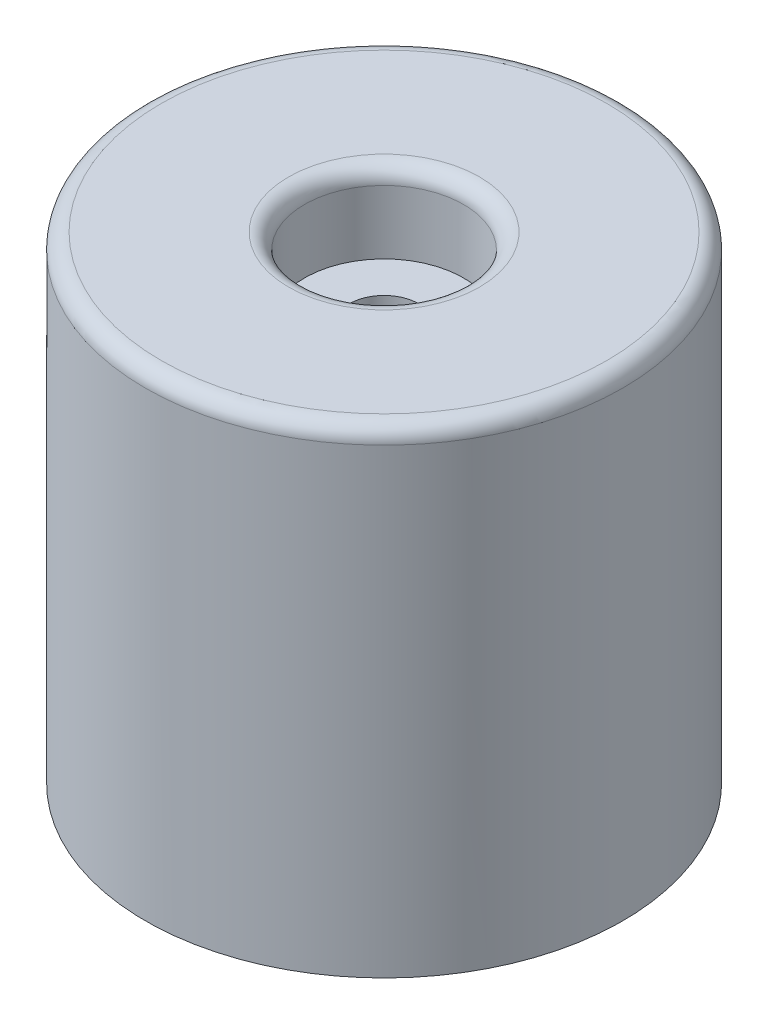
ISO-10303-21;
HEADER;
FILE_DESCRIPTION(('STEP AP214'),'2;1');
FILE_NAME('part.step','',(''),(''),'','','');
FILE_SCHEMA(('AUTOMOTIVE_DESIGN { 1 0 10303 214 1 1 1 1 }'));
ENDSEC;
DATA;
#1=APPLICATION_CONTEXT('core data for automotive mechanical design processes');
#2=APPLICATION_PROTOCOL_DEFINITION('international standard','automotive_design',2000,#1);
#3=PRODUCT_CONTEXT('',#1,'mechanical');
#4=PRODUCT('Part','Part','',(#3));
#5=PRODUCT_RELATED_PRODUCT_CATEGORY('part','',(#4));
#6=PRODUCT_DEFINITION_FORMATION('','',#4);
#7=PRODUCT_DEFINITION_CONTEXT('part definition',#1,'design');
#8=PRODUCT_DEFINITION('design','',#6,#7);
#9=PRODUCT_DEFINITION_SHAPE('','',#8);
#10=(LENGTH_UNIT() NAMED_UNIT(*) SI_UNIT(.MILLI.,.METRE.));
#11=(NAMED_UNIT(*) PLANE_ANGLE_UNIT() SI_UNIT($,.RADIAN.));
#12=(NAMED_UNIT(*) SI_UNIT($,.STERADIAN.) SOLID_ANGLE_UNIT());
#13=UNCERTAINTY_MEASURE_WITH_UNIT(LENGTH_MEASURE(1.E-05),#10,'distance_accuracy_value','');
#14=(GEOMETRIC_REPRESENTATION_CONTEXT(3) GLOBAL_UNCERTAINTY_ASSIGNED_CONTEXT((#13)) GLOBAL_UNIT_ASSIGNED_CONTEXT((#10,
#11,#12)) REPRESENTATION_CONTEXT('',''));
#15=CARTESIAN_POINT('',(0.,0.,0.));
#16=DIRECTION('',(0.,0.,1.));
#17=DIRECTION('',(1.,0.,0.));
#18=AXIS2_PLACEMENT_3D('',#15,#16,#17);
#19=CARTESIAN_POINT('',(0.,38.1,0.));
#20=DIRECTION('',(0.,-1.,0.));
#21=DIRECTION('',(0.,0.,-1.));
#22=AXIS2_PLACEMENT_3D('',#19,#20,#21);
#23=CYLINDRICAL_SURFACE('',#22,19.05);
#24=CARTESIAN_POINT('',(0.,36.83,0.));
#25=DIRECTION('',(0.,1.,0.));
#26=DIRECTION('',(0.,0.,1.));
#27=AXIS2_PLACEMENT_3D('',#24,#25,#26);
#28=CIRCLE('',#27,19.05);
#29=CARTESIAN_POINT('',(0.,36.83,-19.05));
#30=VERTEX_POINT('',#29);
#31=EDGE_CURVE('E10',#30,#30,#28,.F.);
#32=CARTESIAN_POINT('',(0.,0.,0.));
#33=DIRECTION('',(0.,1.,0.));
#34=DIRECTION('',(0.,0.,1.));
#35=AXIS2_PLACEMENT_3D('',#32,#33,#34);
#36=CIRCLE('',#35,19.05);
#37=CARTESIAN_POINT('',(0.,0.,-19.05));
#38=VERTEX_POINT('',#37);
#39=EDGE_CURVE('E52',#38,#38,#36,.T.);
#40=CARTESIAN_POINT('',(0.,36.83,-19.05));
#41=CARTESIAN_POINT('',(0.,36.4463541666667,-19.05));
#42=CARTESIAN_POINT('',(0.,36.0627083333333,-19.05));
#43=CARTESIAN_POINT('',(0.,35.2954166666667,-19.05));
#44=CARTESIAN_POINT('',(0.,34.9117708333333,-19.05));
#45=CARTESIAN_POINT('',(0.,34.1444791666667,-19.05));
#46=CARTESIAN_POINT('',(0.,33.7608333333333,-19.05));
#47=CARTESIAN_POINT('',(0.,32.9935416666667,-19.05));
#48=CARTESIAN_POINT('',(0.,32.6098958333333,-19.05));
#49=CARTESIAN_POINT('',(0.,31.8426041666667,-19.05));
#50=CARTESIAN_POINT('',(0.,31.4589583333333,-19.05));
#51=CARTESIAN_POINT('',(0.,30.6916666666667,-19.05));
#52=CARTESIAN_POINT('',(0.,30.3080208333333,-19.05));
#53=CARTESIAN_POINT('',(0.,29.5407291666667,-19.05));
#54=CARTESIAN_POINT('',(0.,29.1570833333333,-19.05));
#55=CARTESIAN_POINT('',(0.,28.3897916666667,-19.05));
#56=CARTESIAN_POINT('',(0.,28.0061458333333,-19.05));
#57=CARTESIAN_POINT('',(0.,27.2388541666667,-19.05));
#58=CARTESIAN_POINT('',(0.,26.8552083333333,-19.05));
#59=CARTESIAN_POINT('',(0.,26.0879166666667,-19.05));
#60=CARTESIAN_POINT('',(0.,25.7042708333333,-19.05));
#61=CARTESIAN_POINT('',(0.,24.9369791666667,-19.05));
#62=CARTESIAN_POINT('',(0.,24.5533333333333,-19.05));
#63=CARTESIAN_POINT('',(0.,23.7860416666667,-19.05));
#64=CARTESIAN_POINT('',(0.,23.4023958333333,-19.05));
#65=CARTESIAN_POINT('',(0.,22.6351041666667,-19.05));
#66=CARTESIAN_POINT('',(0.,22.2514583333333,-19.05));
#67=CARTESIAN_POINT('',(0.,21.4841666666667,-19.05));
#68=CARTESIAN_POINT('',(0.,21.1005208333333,-19.05));
#69=CARTESIAN_POINT('',(0.,20.3332291666667,-19.05));
#70=CARTESIAN_POINT('',(0.,19.9495833333333,-19.05));
#71=CARTESIAN_POINT('',(0.,19.1822916666667,-19.05));
#72=CARTESIAN_POINT('',(0.,18.7986458333333,-19.05));
#73=CARTESIAN_POINT('',(0.,18.0313541666667,-19.05));
#74=CARTESIAN_POINT('',(0.,17.6477083333333,-19.05));
#75=CARTESIAN_POINT('',(0.,16.8804166666667,-19.05));
#76=CARTESIAN_POINT('',(0.,16.4967708333333,-19.05));
#77=CARTESIAN_POINT('',(0.,15.7294791666667,-19.05));
#78=CARTESIAN_POINT('',(0.,15.3458333333333,-19.05));
#79=CARTESIAN_POINT('',(0.,14.5785416666667,-19.05));
#80=CARTESIAN_POINT('',(0.,14.1948958333333,-19.05));
#81=CARTESIAN_POINT('',(0.,13.4276041666667,-19.05));
#82=CARTESIAN_POINT('',(0.,13.0439583333333,-19.05));
#83=CARTESIAN_POINT('',(0.,12.2766666666667,-19.05));
#84=CARTESIAN_POINT('',(0.,11.8930208333333,-19.05));
#85=CARTESIAN_POINT('',(0.,11.1257291666667,-19.05));
#86=CARTESIAN_POINT('',(0.,10.7420833333333,-19.05));
#87=CARTESIAN_POINT('',(0.,9.97479166666667,-19.05));
#88=CARTESIAN_POINT('',(0.,9.59114583333333,-19.05));
#89=CARTESIAN_POINT('',(0.,8.82385416666667,-19.05));
#90=CARTESIAN_POINT('',(0.,8.44020833333333,-19.05));
#91=CARTESIAN_POINT('',(0.,7.67291666666667,-19.05));
#92=CARTESIAN_POINT('',(0.,7.28927083333333,-19.05));
#93=CARTESIAN_POINT('',(0.,6.52197916666667,-19.05));
#94=CARTESIAN_POINT('',(0.,6.13833333333333,-19.05));
#95=CARTESIAN_POINT('',(0.,5.37104166666667,-19.05));
#96=CARTESIAN_POINT('',(0.,4.98739583333334,-19.05));
#97=CARTESIAN_POINT('',(0.,4.22010416666667,-19.05));
#98=CARTESIAN_POINT('',(0.,3.83645833333333,-19.05));
#99=CARTESIAN_POINT('',(0.,3.06916666666667,-19.05));
#100=CARTESIAN_POINT('',(0.,2.68552083333333,-19.05));
#101=CARTESIAN_POINT('',(0.,1.91822916666667,-19.05));
#102=CARTESIAN_POINT('',(0.,1.53458333333333,-19.05));
#103=CARTESIAN_POINT('',(0.,0.767291666666665,-19.05));
#104=CARTESIAN_POINT('',(0.,0.383645833333332,-19.05));
#105=CARTESIAN_POINT('',(0.,0.,-19.05));
#106=B_SPLINE_CURVE_WITH_KNOTS('',3,(#40,#41,#42,#43,#44,#45,#46,#47,#48,#49,#50,#51,#52,#53,
#54,#55,#56,#57,#58,#59,#60,#61,#62,#63,#64,#65,#66,#67,#68,#69,#70,#71,#72,#73,#74,#75,#76,#77,
#78,#79,#80,#81,#82,#83,#84,#85,#86,#87,#88,#89,#90,#91,#92,#93,#94,#95,#96,#97,#98,#99,#100,
#101,#102,#103,#104,#105),.UNSPECIFIED.,.F.,.F.,(4,2,2,2,2,2,2,2,2,2,2,2,2,2,2,2,2,2,2,2,2,2,2,
2,2,2,2,2,2,2,2,2,4),(0.,1.1509375,2.301875,3.4528125,4.60375,5.7546875,6.905625,8.0565625,
9.20749999999999,10.3584375,11.509375,12.6603125,13.81125,14.9621875,16.113125,17.2640625,
18.415,19.5659375,20.716875,21.8678125,23.01875,24.1696875,25.320625,26.4715625,27.6225,
28.7734375,29.924375,31.0753125,32.22625,33.3771875,34.528125,35.6790625,36.83),.UNSPECIFIED.);
#107=EDGE_CURVE('BSEAM32',#30,#38,#106,.T.);
#108=ORIENTED_EDGE('',*,*,#31,.T.);
#109=ORIENTED_EDGE('',*,*,#39,.T.);
#110=ORIENTED_EDGE('',*,*,#107,.T.);
#111=ORIENTED_EDGE('',*,*,#107,.F.);
#112=EDGE_LOOP('',(#108,#110,#109,#111));
#113=FACE_BOUND('',#112,.T.);
#114=ADVANCED_FACE('F32',(#113),#23,.T.);
#115=CARTESIAN_POINT('',(0.,38.1,0.));
#116=DIRECTION('',(0.,1.,0.));
#117=DIRECTION('',(0.,0.,1.));
#118=AXIS2_PLACEMENT_3D('',#115,#116,#117);
#119=PLANE('',#118);
#120=CARTESIAN_POINT('',(0.,38.1,0.));
#121=DIRECTION('',(0.,1.,0.));
#122=DIRECTION('',(0.,0.,1.));
#123=AXIS2_PLACEMENT_3D('',#120,#121,#122);
#124=CIRCLE('',#123,7.62);
#125=CARTESIAN_POINT('',(0.,38.1,7.62));
#126=VERTEX_POINT('',#125);
#127=EDGE_CURVE('E39',#126,#126,#124,.F.);
#128=ORIENTED_EDGE('',*,*,#127,.T.);
#129=EDGE_LOOP('',(#128));
#130=FACE_BOUND('',#129,.T.);
#131=CARTESIAN_POINT('',(0.,38.1,0.));
#132=DIRECTION('',(0.,1.,0.));
#133=DIRECTION('',(0.,0.,1.));
#134=AXIS2_PLACEMENT_3D('',#131,#132,#133);
#135=CIRCLE('',#134,17.78);
#136=CARTESIAN_POINT('',(0.,38.1,17.78));
#137=VERTEX_POINT('',#136);
#138=EDGE_CURVE('E43',#137,#137,#135,.T.);
#139=ORIENTED_EDGE('',*,*,#138,.T.);
#140=EDGE_LOOP('',(#139));
#141=FACE_BOUND('',#140,.T.);
#142=ADVANCED_FACE('F88',(#130,#141),#119,.T.);
#143=CARTESIAN_POINT('',(0.,0.,0.));
#144=DIRECTION('',(0.,1.,0.));
#145=DIRECTION('',(0.,0.,1.));
#146=AXIS2_PLACEMENT_3D('',#143,#144,#145);
#147=PLANE('',#146);
#148=CARTESIAN_POINT('',(0.,0.,0.));
#149=DIRECTION('',(0.,1.,0.));
#150=DIRECTION('',(0.,0.,1.));
#151=AXIS2_PLACEMENT_3D('',#148,#149,#150);
#152=CIRCLE('',#151,2.778125);
#153=CARTESIAN_POINT('',(0.,0.,2.778125));
#154=VERTEX_POINT('',#153);
#155=EDGE_CURVE('E58',#154,#154,#152,.T.);
#156=ORIENTED_EDGE('',*,*,#155,.T.);
#157=EDGE_LOOP('',(#156));
#158=FACE_BOUND('',#157,.T.);
#159=ORIENTED_EDGE('',*,*,#39,.F.);
#160=EDGE_LOOP('',(#159));
#161=FACE_BOUND('',#160,.T.);
#162=ADVANCED_FACE('F65',(#158,#161),#147,.F.);
#163=CARTESIAN_POINT('',(0.,31.75,0.));
#164=DIRECTION('',(0.,1.,0.));
#165=DIRECTION('',(0.,0.,1.));
#166=AXIS2_PLACEMENT_3D('',#163,#164,#165);
#167=CYLINDRICAL_SURFACE('',#166,6.35);
#168=CARTESIAN_POINT('',(0.,36.83,0.));
#169=DIRECTION('',(0.,1.,0.));
#170=DIRECTION('',(0.,0.,1.));
#171=AXIS2_PLACEMENT_3D('',#168,#169,#170);
#172=CIRCLE('',#171,6.35);
#173=CARTESIAN_POINT('',(0.,36.83,6.35));
#174=VERTEX_POINT('',#173);
#175=EDGE_CURVE('E47',#174,#174,#172,.T.);
#176=ORIENTED_EDGE('',*,*,#175,.T.);
#177=EDGE_LOOP('',(#176));
#178=FACE_BOUND('',#177,.T.);
#179=CARTESIAN_POINT('',(0.,31.75,0.));
#180=DIRECTION('',(0.,1.,0.));
#181=DIRECTION('',(0.,0.,1.));
#182=AXIS2_PLACEMENT_3D('',#179,#180,#181);
#183=CIRCLE('',#182,6.35);
#184=CARTESIAN_POINT('',(0.,31.75,6.35));
#185=VERTEX_POINT('',#184);
#186=EDGE_CURVE('E55',#185,#185,#183,.T.);
#187=ORIENTED_EDGE('',*,*,#186,.F.);
#188=EDGE_LOOP('',(#187));
#189=FACE_BOUND('',#188,.T.);
#190=ADVANCED_FACE('F78',(#178,#189),#167,.F.);
#191=CARTESIAN_POINT('',(0.,31.75,0.));
#192=DIRECTION('',(0.,1.,0.));
#193=DIRECTION('',(0.,0.,1.));
#194=AXIS2_PLACEMENT_3D('',#191,#192,#193);
#195=PLANE('',#194);
#196=CARTESIAN_POINT('',(0.,31.75,0.));
#197=DIRECTION('',(0.,1.,0.));
#198=DIRECTION('',(0.,0.,1.));
#199=AXIS2_PLACEMENT_3D('',#196,#197,#198);
#200=CIRCLE('',#199,2.778125);
#201=CARTESIAN_POINT('',(0.,31.75,2.778125));
#202=VERTEX_POINT('',#201);
#203=EDGE_CURVE('E59',#202,#202,#200,.T.);
#204=ORIENTED_EDGE('',*,*,#203,.F.);
#205=EDGE_LOOP('',(#204));
#206=FACE_BOUND('',#205,.T.);
#207=ORIENTED_EDGE('',*,*,#186,.T.);
#208=EDGE_LOOP('',(#207));
#209=FACE_BOUND('',#208,.T.);
#210=ADVANCED_FACE('F72',(#206,#209),#195,.T.);
#211=CARTESIAN_POINT('',(0.,0.,0.));
#212=DIRECTION('',(0.,1.,0.));
#213=DIRECTION('',(0.,0.,1.));
#214=AXIS2_PLACEMENT_3D('',#211,#212,#213);
#215=CYLINDRICAL_SURFACE('',#214,2.778125);
#216=ORIENTED_EDGE('',*,*,#155,.F.);
#217=EDGE_LOOP('',(#216));
#218=FACE_BOUND('',#217,.T.);
#219=ORIENTED_EDGE('',*,*,#203,.T.);
#220=EDGE_LOOP('',(#219));
#221=FACE_BOUND('',#220,.T.);
#222=ADVANCED_FACE('F68',(#218,#221),#215,.F.);
#223=CARTESIAN_POINT('',(0.,36.83,0.));
#224=DIRECTION('',(0.,1.,0.));
#225=DIRECTION('',(0.,0.,1.));
#226=AXIS2_PLACEMENT_3D('',#223,#224,#225);
#227=TOROIDAL_SURFACE('',#226,7.62,1.27);
#228=ORIENTED_EDGE('',*,*,#127,.F.);
#229=EDGE_LOOP('',(#228));
#230=FACE_BOUND('',#229,.T.);
#231=ORIENTED_EDGE('',*,*,#175,.F.);
#232=EDGE_LOOP('',(#231));
#233=FACE_BOUND('',#232,.T.);
#234=ADVANCED_FACE('F71',(#230,#233),#227,.T.);
#235=CARTESIAN_POINT('',(0.,36.83,0.));
#236=DIRECTION('',(0.,1.,0.));
#237=DIRECTION('',(0.,0.,1.));
#238=AXIS2_PLACEMENT_3D('',#235,#236,#237);
#239=TOROIDAL_SURFACE('',#238,17.78,1.27);
#240=ORIENTED_EDGE('',*,*,#31,.F.);
#241=EDGE_LOOP('',(#240));
#242=FACE_BOUND('',#241,.T.);
#243=ORIENTED_EDGE('',*,*,#138,.F.);
#244=EDGE_LOOP('',(#243));
#245=FACE_BOUND('',#244,.T.);
#246=ADVANCED_FACE('F34',(#242,#245),#239,.T.);
#247=CLOSED_SHELL('',(#114,#142,#162,#190,#210,#222,#234,#246));
#248=MANIFOLD_SOLID_BREP('B2',#247);
#249=ADVANCED_BREP_SHAPE_REPRESENTATION('',(#18,#248),#14);
#250=SHAPE_DEFINITION_REPRESENTATION(#9,#249);
ENDSEC;
END-ISO-10303-21;
